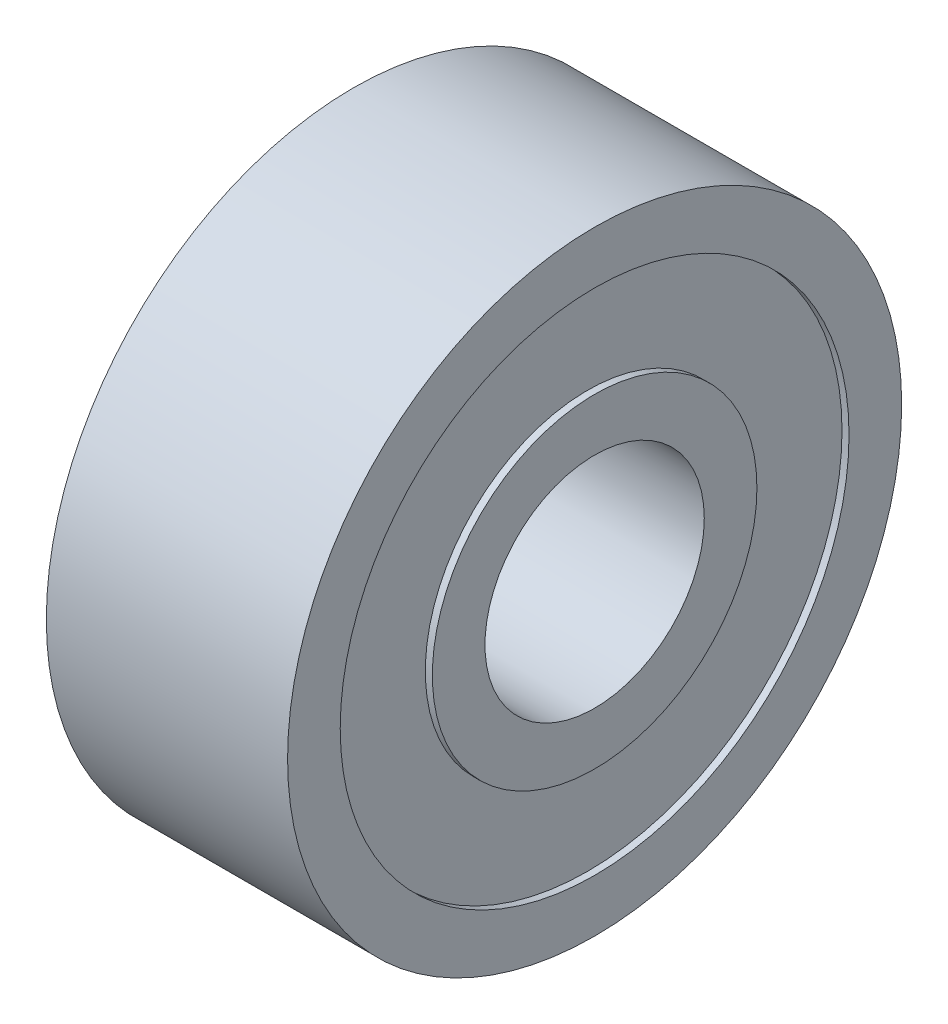
ISO-10303-21;
HEADER;
FILE_DESCRIPTION(('STEP AP214'),'2;1');
FILE_NAME('part.step','',(''),(''),'','','');
FILE_SCHEMA(('AUTOMOTIVE_DESIGN { 1 0 10303 214 1 1 1 1 }'));
ENDSEC;
DATA;
#1=APPLICATION_CONTEXT('core data for automotive mechanical design processes');
#2=APPLICATION_PROTOCOL_DEFINITION('international standard','automotive_design',2000,#1);
#3=PRODUCT_CONTEXT('',#1,'mechanical');
#4=PRODUCT('Part','Part','',(#3));
#5=PRODUCT_RELATED_PRODUCT_CATEGORY('part','',(#4));
#6=PRODUCT_DEFINITION_FORMATION('','',#4);
#7=PRODUCT_DEFINITION_CONTEXT('part definition',#1,'design');
#8=PRODUCT_DEFINITION('design','',#6,#7);
#9=PRODUCT_DEFINITION_SHAPE('','',#8);
#10=(LENGTH_UNIT() NAMED_UNIT(*) SI_UNIT(.MILLI.,.METRE.));
#11=(NAMED_UNIT(*) PLANE_ANGLE_UNIT() SI_UNIT($,.RADIAN.));
#12=(NAMED_UNIT(*) SI_UNIT($,.STERADIAN.) SOLID_ANGLE_UNIT());
#13=UNCERTAINTY_MEASURE_WITH_UNIT(LENGTH_MEASURE(1.E-05),#10,'distance_accuracy_value','');
#14=(GEOMETRIC_REPRESENTATION_CONTEXT(3) GLOBAL_UNCERTAINTY_ASSIGNED_CONTEXT((#13)) GLOBAL_UNIT_ASSIGNED_CONTEXT((#10,
#11,#12)) REPRESENTATION_CONTEXT('',''));
#15=CARTESIAN_POINT('',(0.,0.,0.));
#16=DIRECTION('',(0.,0.,1.));
#17=DIRECTION('',(1.,0.,0.));
#18=AXIS2_PLACEMENT_3D('',#15,#16,#17);
#19=CARTESIAN_POINT('',(-4.365625,0.,0.));
#20=DIRECTION('',(1.,0.,0.));
#21=DIRECTION('',(0.,0.,-1.));
#22=AXIS2_PLACEMENT_3D('',#19,#20,#21);
#23=PLANE('',#22);
#24=CARTESIAN_POINT('',(-4.365625,0.,0.));
#25=DIRECTION('',(1.,0.,0.));
#26=DIRECTION('',(0.,0.,-1.));
#27=AXIS2_PLACEMENT_3D('',#24,#25,#26);
#28=CIRCLE('',#27,3.96875);
#29=CARTESIAN_POINT('',(-4.365625,0.,-3.96875));
#30=VERTEX_POINT('',#29);
#31=EDGE_CURVE('E58',#30,#30,#28,.T.);
#32=ORIENTED_EDGE('',*,*,#31,.T.);
#33=EDGE_LOOP('',(#32));
#34=FACE_BOUND('',#33,.T.);
#35=CARTESIAN_POINT('',(-4.365625,0.,0.));
#36=DIRECTION('',(1.,0.,0.));
#37=DIRECTION('',(0.,0.,-1.));
#38=AXIS2_PLACEMENT_3D('',#35,#36,#37);
#39=CIRCLE('',#38,5.87375);
#40=CARTESIAN_POINT('',(-4.365625,0.,-5.87375));
#41=VERTEX_POINT('',#40);
#42=EDGE_CURVE('E90',#41,#41,#39,.T.);
#43=ORIENTED_EDGE('',*,*,#42,.F.);
#44=EDGE_LOOP('',(#43));
#45=FACE_BOUND('',#44,.T.);
#46=ADVANCED_FACE('F43',(#34,#45),#23,.F.);
#47=CARTESIAN_POINT('',(4.365625,0.,0.));
#48=DIRECTION('',(1.,0.,0.));
#49=DIRECTION('',(0.,0.,-1.));
#50=AXIS2_PLACEMENT_3D('',#47,#48,#49);
#51=PLANE('',#50);
#52=CARTESIAN_POINT('',(4.365625,0.,0.));
#53=DIRECTION('',(1.,0.,0.));
#54=DIRECTION('',(0.,0.,-1.));
#55=AXIS2_PLACEMENT_3D('',#52,#53,#54);
#56=CIRCLE('',#55,3.96875);
#57=CARTESIAN_POINT('',(4.365625,0.,-3.96875));
#58=VERTEX_POINT('',#57);
#59=EDGE_CURVE('E56',#58,#58,#56,.T.);
#60=ORIENTED_EDGE('',*,*,#59,.F.);
#61=EDGE_LOOP('',(#60));
#62=FACE_BOUND('',#61,.T.);
#63=CARTESIAN_POINT('',(4.365625,0.,0.));
#64=DIRECTION('',(1.,0.,0.));
#65=DIRECTION('',(0.,0.,-1.));
#66=AXIS2_PLACEMENT_3D('',#63,#64,#65);
#67=CIRCLE('',#66,5.87375);
#68=CARTESIAN_POINT('',(4.365625,0.,-5.87375));
#69=VERTEX_POINT('',#68);
#70=EDGE_CURVE('E74',#69,#69,#67,.T.);
#71=ORIENTED_EDGE('',*,*,#70,.T.);
#72=EDGE_LOOP('',(#71));
#73=FACE_BOUND('',#72,.T.);
#74=ADVANCED_FACE('F108',(#62,#73),#51,.T.);
#75=CARTESIAN_POINT('',(4.365625,0.,0.));
#76=DIRECTION('',(1.,0.,0.));
#77=DIRECTION('',(0.,0.,-1.));
#78=AXIS2_PLACEMENT_3D('',#75,#76,#77);
#79=CIRCLE('',#78,9.2075);
#80=CARTESIAN_POINT('',(4.365625,0.,-9.2075));
#81=VERTEX_POINT('',#80);
#82=EDGE_CURVE('E66',#81,#81,#79,.T.);
#83=ORIENTED_EDGE('',*,*,#82,.F.);
#84=EDGE_LOOP('',(#83));
#85=FACE_BOUND('',#84,.T.);
#86=CARTESIAN_POINT('',(4.365625,0.,0.));
#87=DIRECTION('',(1.,0.,0.));
#88=DIRECTION('',(0.,0.,-1.));
#89=AXIS2_PLACEMENT_3D('',#86,#87,#88);
#90=CIRCLE('',#89,11.1125);
#91=CARTESIAN_POINT('',(4.365625,0.,-11.1125));
#92=VERTEX_POINT('',#91);
#93=EDGE_CURVE('E10',#92,#92,#90,.T.);
#94=ORIENTED_EDGE('',*,*,#93,.T.);
#95=EDGE_LOOP('',(#94));
#96=FACE_BOUND('',#95,.T.);
#97=ADVANCED_FACE('F116',(#85,#96),#51,.T.);
#98=CARTESIAN_POINT('',(-4.365625,0.,0.));
#99=DIRECTION('',(1.,0.,0.));
#100=DIRECTION('',(0.,0.,-1.));
#101=AXIS2_PLACEMENT_3D('',#98,#99,#100);
#102=CIRCLE('',#101,9.2075);
#103=CARTESIAN_POINT('',(-4.365625,0.,-9.2075));
#104=VERTEX_POINT('',#103);
#105=EDGE_CURVE('E82',#104,#104,#102,.T.);
#106=ORIENTED_EDGE('',*,*,#105,.T.);
#107=EDGE_LOOP('',(#106));
#108=FACE_BOUND('',#107,.T.);
#109=CARTESIAN_POINT('',(-4.365625,0.,0.));
#110=DIRECTION('',(1.,0.,0.));
#111=DIRECTION('',(0.,0.,-1.));
#112=AXIS2_PLACEMENT_3D('',#109,#110,#111);
#113=CIRCLE('',#112,11.1125);
#114=CARTESIAN_POINT('',(-4.365625,0.,-11.1125));
#115=VERTEX_POINT('',#114);
#116=EDGE_CURVE('E47',#115,#115,#113,.T.);
#117=ORIENTED_EDGE('',*,*,#116,.F.);
#118=EDGE_LOOP('',(#117));
#119=FACE_BOUND('',#118,.T.);
#120=ADVANCED_FACE('F110',(#108,#119),#23,.F.);
#121=CARTESIAN_POINT('',(4.365625,0.,0.));
#122=DIRECTION('',(-1.,0.,0.));
#123=DIRECTION('',(0.,0.,1.));
#124=AXIS2_PLACEMENT_3D('',#121,#122,#123);
#125=CYLINDRICAL_SURFACE('',#124,11.1125);
#126=ORIENTED_EDGE('',*,*,#93,.F.);
#127=EDGE_LOOP('',(#126));
#128=FACE_BOUND('',#127,.T.);
#129=ORIENTED_EDGE('',*,*,#116,.T.);
#130=EDGE_LOOP('',(#129));
#131=FACE_BOUND('',#130,.T.);
#132=ADVANCED_FACE('F45',(#128,#131),#125,.T.);
#133=CARTESIAN_POINT('',(4.365625,0.,0.));
#134=DIRECTION('',(-1.,0.,0.));
#135=DIRECTION('',(0.,0.,1.));
#136=AXIS2_PLACEMENT_3D('',#133,#134,#135);
#137=CYLINDRICAL_SURFACE('',#136,3.96875);
#138=ORIENTED_EDGE('',*,*,#59,.T.);
#139=EDGE_LOOP('',(#138));
#140=FACE_BOUND('',#139,.T.);
#141=ORIENTED_EDGE('',*,*,#31,.F.);
#142=EDGE_LOOP('',(#141));
#143=FACE_BOUND('',#142,.T.);
#144=ADVANCED_FACE('F124',(#140,#143),#137,.F.);
#145=CARTESIAN_POINT('',(4.111625,0.,0.));
#146=DIRECTION('',(1.,0.,0.));
#147=DIRECTION('',(0.,0.,-1.));
#148=AXIS2_PLACEMENT_3D('',#145,#146,#147);
#149=CYLINDRICAL_SURFACE('',#148,9.2075);
#150=CARTESIAN_POINT('',(4.111625,0.,0.));
#151=DIRECTION('',(1.,0.,0.));
#152=DIRECTION('',(0.,0.,-1.));
#153=AXIS2_PLACEMENT_3D('',#150,#151,#152);
#154=CIRCLE('',#153,9.2075);
#155=CARTESIAN_POINT('',(4.111625,0.,-9.2075));
#156=VERTEX_POINT('',#155);
#157=EDGE_CURVE('E62',#156,#156,#154,.T.);
#158=ORIENTED_EDGE('',*,*,#157,.F.);
#159=EDGE_LOOP('',(#158));
#160=FACE_BOUND('',#159,.T.);
#161=ORIENTED_EDGE('',*,*,#82,.T.);
#162=EDGE_LOOP('',(#161));
#163=FACE_BOUND('',#162,.T.);
#164=ADVANCED_FACE('F147',(#160,#163),#149,.F.);
#165=CARTESIAN_POINT('',(4.111625,0.,0.));
#166=DIRECTION('',(1.,0.,0.));
#167=DIRECTION('',(0.,0.,-1.));
#168=AXIS2_PLACEMENT_3D('',#165,#166,#167);
#169=PLANE('',#168);
#170=CARTESIAN_POINT('',(4.111625,0.,0.));
#171=DIRECTION('',(1.,0.,0.));
#172=DIRECTION('',(0.,0.,-1.));
#173=AXIS2_PLACEMENT_3D('',#170,#171,#172);
#174=CIRCLE('',#173,5.87375);
#175=CARTESIAN_POINT('',(4.111625,0.,-5.87375));
#176=VERTEX_POINT('',#175);
#177=EDGE_CURVE('E70',#176,#176,#174,.T.);
#178=ORIENTED_EDGE('',*,*,#177,.F.);
#179=EDGE_LOOP('',(#178));
#180=FACE_BOUND('',#179,.T.);
#181=ORIENTED_EDGE('',*,*,#157,.T.);
#182=EDGE_LOOP('',(#181));
#183=FACE_BOUND('',#182,.T.);
#184=ADVANCED_FACE('F143',(#180,#183),#169,.T.);
#185=CARTESIAN_POINT('',(4.111625,0.,0.));
#186=DIRECTION('',(1.,0.,0.));
#187=DIRECTION('',(0.,0.,-1.));
#188=AXIS2_PLACEMENT_3D('',#185,#186,#187);
#189=CYLINDRICAL_SURFACE('',#188,5.87375);
#190=ORIENTED_EDGE('',*,*,#177,.T.);
#191=EDGE_LOOP('',(#190));
#192=FACE_BOUND('',#191,.T.);
#193=ORIENTED_EDGE('',*,*,#70,.F.);
#194=EDGE_LOOP('',(#193));
#195=FACE_BOUND('',#194,.T.);
#196=ADVANCED_FACE('F138',(#192,#195),#189,.T.);
#197=CARTESIAN_POINT('',(-4.111625,0.,0.));
#198=DIRECTION('',(-1.,0.,0.));
#199=DIRECTION('',(0.,0.,-1.));
#200=AXIS2_PLACEMENT_3D('',#197,#198,#199);
#201=PLANE('',#200);
#202=CARTESIAN_POINT('',(-4.111625,0.,0.));
#203=DIRECTION('',(1.,0.,0.));
#204=DIRECTION('',(0.,0.,-1.));
#205=AXIS2_PLACEMENT_3D('',#202,#203,#204);
#206=CIRCLE('',#205,9.2075);
#207=CARTESIAN_POINT('',(-4.111625,0.,-9.2075));
#208=VERTEX_POINT('',#207);
#209=EDGE_CURVE('E78',#208,#208,#206,.T.);
#210=ORIENTED_EDGE('',*,*,#209,.F.);
#211=EDGE_LOOP('',(#210));
#212=FACE_BOUND('',#211,.T.);
#213=CARTESIAN_POINT('',(-4.111625,0.,0.));
#214=DIRECTION('',(1.,0.,0.));
#215=DIRECTION('',(0.,0.,-1.));
#216=AXIS2_PLACEMENT_3D('',#213,#214,#215);
#217=CIRCLE('',#216,5.87375);
#218=CARTESIAN_POINT('',(-4.111625,0.,-5.87375));
#219=VERTEX_POINT('',#218);
#220=EDGE_CURVE('E86',#219,#219,#217,.T.);
#221=ORIENTED_EDGE('',*,*,#220,.T.);
#222=EDGE_LOOP('',(#221));
#223=FACE_BOUND('',#222,.T.);
#224=ADVANCED_FACE('F98',(#212,#223),#201,.T.);
#225=CARTESIAN_POINT('',(-4.111625,0.,0.));
#226=DIRECTION('',(-1.,0.,0.));
#227=DIRECTION('',(0.,0.,1.));
#228=AXIS2_PLACEMENT_3D('',#225,#226,#227);
#229=CYLINDRICAL_SURFACE('',#228,9.2075);
#230=ORIENTED_EDGE('',*,*,#209,.T.);
#231=EDGE_LOOP('',(#230));
#232=FACE_BOUND('',#231,.T.);
#233=ORIENTED_EDGE('',*,*,#105,.F.);
#234=EDGE_LOOP('',(#233));
#235=FACE_BOUND('',#234,.T.);
#236=ADVANCED_FACE('F103',(#232,#235),#229,.F.);
#237=CARTESIAN_POINT('',(-4.111625,0.,0.));
#238=DIRECTION('',(-1.,0.,0.));
#239=DIRECTION('',(0.,0.,1.));
#240=AXIS2_PLACEMENT_3D('',#237,#238,#239);
#241=CYLINDRICAL_SURFACE('',#240,5.87375);
#242=ORIENTED_EDGE('',*,*,#220,.F.);
#243=EDGE_LOOP('',(#242));
#244=FACE_BOUND('',#243,.T.);
#245=ORIENTED_EDGE('',*,*,#42,.T.);
#246=EDGE_LOOP('',(#245));
#247=FACE_BOUND('',#246,.T.);
#248=ADVANCED_FACE('F100',(#244,#247),#241,.T.);
#249=CLOSED_SHELL('',(#46,#74,#97,#120,#132,#144,#164,#184,#196,#224,#236,#248));
#250=MANIFOLD_SOLID_BREP('B2',#249);
#251=ADVANCED_BREP_SHAPE_REPRESENTATION('',(#18,#250),#14);
#252=SHAPE_DEFINITION_REPRESENTATION(#9,#251);
ENDSEC;
END-ISO-10303-21;
